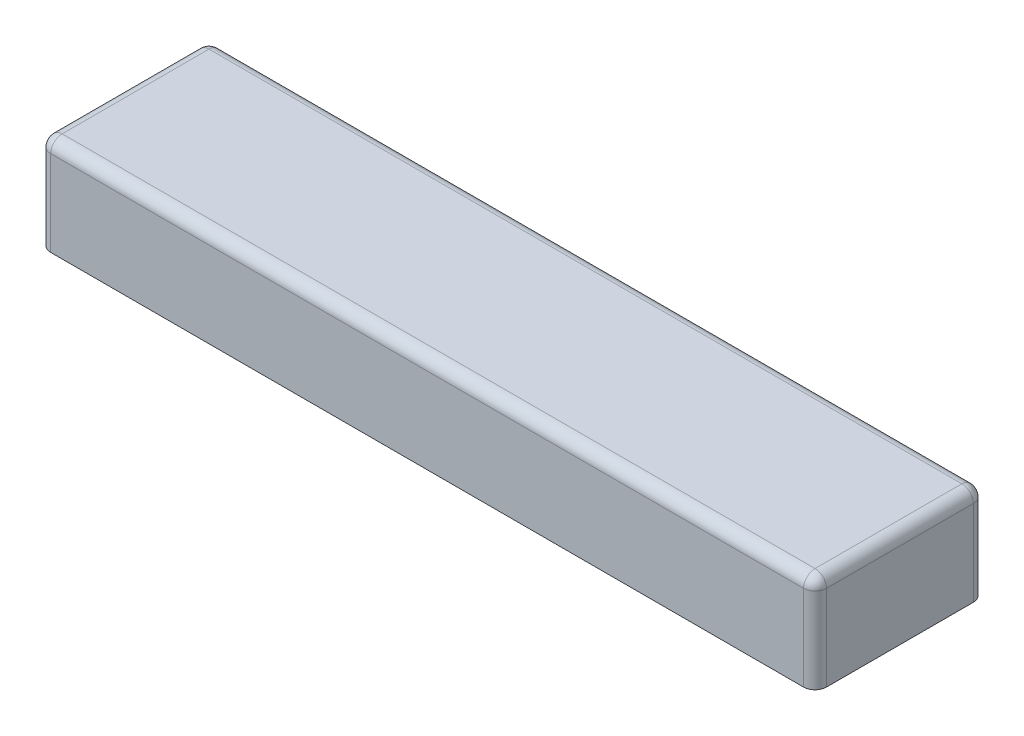
ISO-10303-21;
HEADER;
FILE_DESCRIPTION(('STEP AP214'),'2;1');
FILE_NAME('part.step','',(''),(''),'','','');
FILE_SCHEMA(('AUTOMOTIVE_DESIGN { 1 0 10303 214 1 1 1 1 }'));
ENDSEC;
DATA;
#1=APPLICATION_CONTEXT('core data for automotive mechanical design processes');
#2=APPLICATION_PROTOCOL_DEFINITION('international standard','automotive_design',2000,#1);
#3=PRODUCT_CONTEXT('',#1,'mechanical');
#4=PRODUCT('Part','Part','',(#3));
#5=PRODUCT_RELATED_PRODUCT_CATEGORY('part','',(#4));
#6=PRODUCT_DEFINITION_FORMATION('','',#4);
#7=PRODUCT_DEFINITION_CONTEXT('part definition',#1,'design');
#8=PRODUCT_DEFINITION('design','',#6,#7);
#9=PRODUCT_DEFINITION_SHAPE('','',#8);
#10=(LENGTH_UNIT() NAMED_UNIT(*) SI_UNIT(.MILLI.,.METRE.));
#11=(NAMED_UNIT(*) PLANE_ANGLE_UNIT() SI_UNIT($,.RADIAN.));
#12=(NAMED_UNIT(*) SI_UNIT($,.STERADIAN.) SOLID_ANGLE_UNIT());
#13=UNCERTAINTY_MEASURE_WITH_UNIT(LENGTH_MEASURE(1.E-05),#10,'distance_accuracy_value','');
#14=(GEOMETRIC_REPRESENTATION_CONTEXT(3) GLOBAL_UNCERTAINTY_ASSIGNED_CONTEXT((#13)) GLOBAL_UNIT_ASSIGNED_CONTEXT((#10,
#11,#12)) REPRESENTATION_CONTEXT('',''));
#15=CARTESIAN_POINT('',(0.,0.,0.));
#16=DIRECTION('',(0.,0.,1.));
#17=DIRECTION('',(1.,0.,0.));
#18=AXIS2_PLACEMENT_3D('',#15,#16,#17);
#19=CARTESIAN_POINT('',(0.,25.4,0.));
#20=DIRECTION('',(1.,0.,0.));
#21=DIRECTION('',(0.,0.,-1.));
#22=AXIS2_PLACEMENT_3D('',#19,#20,#21);
#23=PLANE('',#22);
#24=DIRECTION('',(0.,0.,1.));
#25=VECTOR('',#24,1.);
#26=CARTESIAN_POINT('',(0.,22.4,0.));
#27=LINE('',#26,#25);
#28=CARTESIAN_POINT('',(0.,22.4,-3.));
#29=VERTEX_POINT('',#28);
#30=CARTESIAN_POINT('',(0.,22.4,-41.45));
#31=VERTEX_POINT('',#30);
#32=EDGE_CURVE('E51',#29,#31,#27,.F.);
#33=ORIENTED_EDGE('',*,*,#32,.T.);
#34=DIRECTION('',(0.,-1.,0.));
#35=VECTOR('',#34,1.);
#36=CARTESIAN_POINT('',(0.,25.4,-41.45));
#37=LINE('',#36,#35);
#38=CARTESIAN_POINT('',(0.,0.,-41.45));
#39=VERTEX_POINT('',#38);
#40=EDGE_CURVE('E170',#31,#39,#37,.T.);
#41=ORIENTED_EDGE('',*,*,#40,.T.);
#42=DIRECTION('',(0.,0.,1.));
#43=VECTOR('',#42,1.);
#44=CARTESIAN_POINT('',(0.,0.,0.));
#45=LINE('',#44,#43);
#46=CARTESIAN_POINT('',(0.,0.,-3.));
#47=VERTEX_POINT('',#46);
#48=EDGE_CURVE('E199',#39,#47,#45,.T.);
#49=ORIENTED_EDGE('',*,*,#48,.T.);
#50=DIRECTION('',(0.,-1.,0.));
#51=VECTOR('',#50,1.);
#52=CARTESIAN_POINT('',(0.,25.4,-3.));
#53=LINE('',#52,#51);
#54=EDGE_CURVE('E56',#47,#29,#53,.F.);
#55=ORIENTED_EDGE('',*,*,#54,.T.);
#56=EDGE_LOOP('',(#33,#41,#49,#55));
#57=FACE_BOUND('',#56,.T.);
#58=ADVANCED_FACE('F34',(#57),#23,.F.);
#59=CARTESIAN_POINT('',(0.,25.4,0.));
#60=DIRECTION('',(0.,0.,-1.));
#61=DIRECTION('',(-1.,0.,0.));
#62=AXIS2_PLACEMENT_3D('',#59,#60,#61);
#63=PLANE('',#62);
#64=DIRECTION('',(1.,0.,0.));
#65=VECTOR('',#64,1.);
#66=CARTESIAN_POINT('',(0.,0.,0.));
#67=LINE('',#66,#65);
#68=CARTESIAN_POINT('',(3.,0.,0.));
#69=VERTEX_POINT('',#68);
#70=CARTESIAN_POINT('',(200.2,0.,0.));
#71=VERTEX_POINT('',#70);
#72=EDGE_CURVE('E201',#69,#71,#67,.T.);
#73=ORIENTED_EDGE('',*,*,#72,.T.);
#74=DIRECTION('',(0.,-1.,0.));
#75=VECTOR('',#74,1.);
#76=CARTESIAN_POINT('',(200.2,25.4,0.));
#77=LINE('',#76,#75);
#78=CARTESIAN_POINT('',(200.2,22.4,0.));
#79=VERTEX_POINT('',#78);
#80=EDGE_CURVE('E166',#71,#79,#77,.F.);
#81=ORIENTED_EDGE('',*,*,#80,.T.);
#82=DIRECTION('',(1.,0.,0.));
#83=VECTOR('',#82,1.);
#84=CARTESIAN_POINT('',(0.,22.4,0.));
#85=LINE('',#84,#83);
#86=CARTESIAN_POINT('',(3.,22.4,0.));
#87=VERTEX_POINT('',#86);
#88=EDGE_CURVE('E164',#79,#87,#85,.F.);
#89=ORIENTED_EDGE('',*,*,#88,.T.);
#90=DIRECTION('',(0.,-1.,0.));
#91=VECTOR('',#90,1.);
#92=CARTESIAN_POINT('',(3.,25.4,0.));
#93=LINE('',#92,#91);
#94=EDGE_CURVE('E162',#87,#69,#93,.T.);
#95=ORIENTED_EDGE('',*,*,#94,.T.);
#96=EDGE_LOOP('',(#73,#81,#89,#95));
#97=FACE_BOUND('',#96,.T.);
#98=ADVANCED_FACE('F253',(#97),#63,.F.);
#99=CARTESIAN_POINT('',(203.2,25.4,0.));
#100=DIRECTION('',(-1.,0.,0.));
#101=DIRECTION('',(0.,0.,1.));
#102=AXIS2_PLACEMENT_3D('',#99,#100,#101);
#103=PLANE('',#102);
#104=DIRECTION('',(0.,0.,-1.));
#105=VECTOR('',#104,1.);
#106=CARTESIAN_POINT('',(203.2,0.,0.));
#107=LINE('',#106,#105);
#108=CARTESIAN_POINT('',(203.2,0.,-3.));
#109=VERTEX_POINT('',#108);
#110=CARTESIAN_POINT('',(203.2,0.,-41.45));
#111=VERTEX_POINT('',#110);
#112=EDGE_CURVE('E205',#109,#111,#107,.T.);
#113=ORIENTED_EDGE('',*,*,#112,.T.);
#114=DIRECTION('',(0.,-1.,0.));
#115=VECTOR('',#114,1.);
#116=CARTESIAN_POINT('',(203.2,25.4,-41.45));
#117=LINE('',#116,#115);
#118=CARTESIAN_POINT('',(203.2,22.4,-41.45));
#119=VERTEX_POINT('',#118);
#120=EDGE_CURVE('E160',#111,#119,#117,.F.);
#121=ORIENTED_EDGE('',*,*,#120,.T.);
#122=DIRECTION('',(0.,0.,-1.));
#123=VECTOR('',#122,1.);
#124=CARTESIAN_POINT('',(203.2,22.4,0.));
#125=LINE('',#124,#123);
#126=CARTESIAN_POINT('',(203.2,22.4,-3.));
#127=VERTEX_POINT('',#126);
#128=EDGE_CURVE('E158',#119,#127,#125,.F.);
#129=ORIENTED_EDGE('',*,*,#128,.T.);
#130=DIRECTION('',(0.,-1.,0.));
#131=VECTOR('',#130,1.);
#132=CARTESIAN_POINT('',(203.2,25.4,-3.));
#133=LINE('',#132,#131);
#134=EDGE_CURVE('E156',#127,#109,#133,.T.);
#135=ORIENTED_EDGE('',*,*,#134,.T.);
#136=EDGE_LOOP('',(#113,#121,#129,#135));
#137=FACE_BOUND('',#136,.T.);
#138=ADVANCED_FACE('F258',(#137),#103,.F.);
#139=CARTESIAN_POINT('',(0.,25.4,-44.45));
#140=DIRECTION('',(0.,0.,1.));
#141=DIRECTION('',(1.,0.,0.));
#142=AXIS2_PLACEMENT_3D('',#139,#140,#141);
#143=PLANE('',#142);
#144=DIRECTION('',(-1.,0.,0.));
#145=VECTOR('',#144,1.);
#146=CARTESIAN_POINT('',(0.,0.,-44.45));
#147=LINE('',#146,#145);
#148=CARTESIAN_POINT('',(200.2,0.,-44.45));
#149=VERTEX_POINT('',#148);
#150=CARTESIAN_POINT('',(3.,0.,-44.45));
#151=VERTEX_POINT('',#150);
#152=EDGE_CURVE('E141',#149,#151,#147,.T.);
#153=ORIENTED_EDGE('',*,*,#152,.T.);
#154=DIRECTION('',(0.,-1.,0.));
#155=VECTOR('',#154,1.);
#156=CARTESIAN_POINT('',(3.,25.4,-44.45));
#157=LINE('',#156,#155);
#158=CARTESIAN_POINT('',(3.,22.4,-44.45));
#159=VERTEX_POINT('',#158);
#160=EDGE_CURVE('E154',#151,#159,#157,.F.);
#161=ORIENTED_EDGE('',*,*,#160,.T.);
#162=DIRECTION('',(-1.,0.,0.));
#163=VECTOR('',#162,1.);
#164=CARTESIAN_POINT('',(0.,22.4,-44.45));
#165=LINE('',#164,#163);
#166=CARTESIAN_POINT('',(200.2,22.4,-44.45));
#167=VERTEX_POINT('',#166);
#168=EDGE_CURVE('E119',#159,#167,#165,.F.);
#169=ORIENTED_EDGE('',*,*,#168,.T.);
#170=DIRECTION('',(0.,-1.,0.));
#171=VECTOR('',#170,1.);
#172=CARTESIAN_POINT('',(200.2,25.4,-44.45));
#173=LINE('',#172,#171);
#174=EDGE_CURVE('E147',#167,#149,#173,.T.);
#175=ORIENTED_EDGE('',*,*,#174,.T.);
#176=EDGE_LOOP('',(#153,#161,#169,#175));
#177=FACE_BOUND('',#176,.T.);
#178=ADVANCED_FACE('F230',(#177),#143,.F.);
#179=CARTESIAN_POINT('',(0.,25.4,0.));
#180=DIRECTION('',(0.,-1.,0.));
#181=DIRECTION('',(0.,0.,-1.));
#182=AXIS2_PLACEMENT_3D('',#179,#180,#181);
#183=PLANE('',#182);
#184=DIRECTION('',(0.,0.,-1.));
#185=VECTOR('',#184,1.);
#186=CARTESIAN_POINT('',(200.2,25.4,0.));
#187=LINE('',#186,#185);
#188=CARTESIAN_POINT('',(200.2,25.4,-3.));
#189=VERTEX_POINT('',#188);
#190=CARTESIAN_POINT('',(200.2,25.4,-41.45));
#191=VERTEX_POINT('',#190);
#192=EDGE_CURVE('E145',#189,#191,#187,.T.);
#193=ORIENTED_EDGE('',*,*,#192,.T.);
#194=DIRECTION('',(-1.,0.,0.));
#195=VECTOR('',#194,1.);
#196=CARTESIAN_POINT('',(0.,25.4,-41.45));
#197=LINE('',#196,#195);
#198=CARTESIAN_POINT('',(3.,25.4,-41.45));
#199=VERTEX_POINT('',#198);
#200=EDGE_CURVE('E117',#191,#199,#197,.T.);
#201=ORIENTED_EDGE('',*,*,#200,.T.);
#202=DIRECTION('',(0.,0.,1.));
#203=VECTOR('',#202,1.);
#204=CARTESIAN_POINT('',(3.,25.4,0.));
#205=LINE('',#204,#203);
#206=CARTESIAN_POINT('',(3.,25.4,-3.));
#207=VERTEX_POINT('',#206);
#208=EDGE_CURVE('E134',#199,#207,#205,.T.);
#209=ORIENTED_EDGE('',*,*,#208,.T.);
#210=DIRECTION('',(1.,0.,0.));
#211=VECTOR('',#210,1.);
#212=CARTESIAN_POINT('',(0.,25.4,-3.));
#213=LINE('',#212,#211);
#214=EDGE_CURVE('E140',#207,#189,#213,.T.);
#215=ORIENTED_EDGE('',*,*,#214,.T.);
#216=EDGE_LOOP('',(#193,#201,#209,#215));
#217=FACE_BOUND('',#216,.T.);
#218=ADVANCED_FACE('F143',(#217),#183,.F.);
#219=CARTESIAN_POINT('',(0.,0.,0.));
#220=DIRECTION('',(0.,-1.,0.));
#221=DIRECTION('',(0.,0.,-1.));
#222=AXIS2_PLACEMENT_3D('',#219,#220,#221);
#223=PLANE('',#222);
#224=ORIENTED_EDGE('',*,*,#48,.F.);
#225=CARTESIAN_POINT('',(3.,0.,-41.45));
#226=DIRECTION('',(0.,-1.,0.));
#227=DIRECTION('',(0.,0.,-1.));
#228=AXIS2_PLACEMENT_3D('',#225,#226,#227);
#229=CIRCLE('',#228,3.);
#230=EDGE_CURVE('E11',#39,#151,#229,.T.);
#231=ORIENTED_EDGE('',*,*,#230,.T.);
#232=ORIENTED_EDGE('',*,*,#152,.F.);
#233=CARTESIAN_POINT('',(200.2,0.,-41.45));
#234=DIRECTION('',(0.,-1.,0.));
#235=DIRECTION('',(0.,0.,-1.));
#236=AXIS2_PLACEMENT_3D('',#233,#234,#235);
#237=CIRCLE('',#236,3.);
#238=EDGE_CURVE('E43',#149,#111,#237,.T.);
#239=ORIENTED_EDGE('',*,*,#238,.T.);
#240=ORIENTED_EDGE('',*,*,#112,.F.);
#241=CARTESIAN_POINT('',(200.2,0.,-3.));
#242=DIRECTION('',(0.,-1.,0.));
#243=DIRECTION('',(0.,0.,-1.));
#244=AXIS2_PLACEMENT_3D('',#241,#242,#243);
#245=CIRCLE('',#244,3.);
#246=EDGE_CURVE('E174',#109,#71,#245,.T.);
#247=ORIENTED_EDGE('',*,*,#246,.T.);
#248=ORIENTED_EDGE('',*,*,#72,.F.);
#249=CARTESIAN_POINT('',(3.,0.,-3.));
#250=DIRECTION('',(0.,-1.,0.));
#251=DIRECTION('',(0.,0.,-1.));
#252=AXIS2_PLACEMENT_3D('',#249,#250,#251);
#253=CIRCLE('',#252,3.);
#254=EDGE_CURVE('E172',#69,#47,#253,.T.);
#255=ORIENTED_EDGE('',*,*,#254,.T.);
#256=EDGE_LOOP('',(#224,#231,#232,#239,#240,#247,#248,#255));
#257=FACE_BOUND('',#256,.T.);
#258=ADVANCED_FACE('F236',(#257),#223,.T.);
#259=CARTESIAN_POINT('',(200.2,25.4,-3.));
#260=DIRECTION('',(0.,-1.,0.));
#261=DIRECTION('',(0.,0.,-1.));
#262=AXIS2_PLACEMENT_3D('',#259,#260,#261);
#263=CYLINDRICAL_SURFACE('',#262,3.);
#264=ORIENTED_EDGE('',*,*,#246,.F.);
#265=ORIENTED_EDGE('',*,*,#134,.F.);
#266=CARTESIAN_POINT('',(200.2,22.4,-3.));
#267=DIRECTION('',(0.,1.,0.));
#268=DIRECTION('',(0.,0.,1.));
#269=AXIS2_PLACEMENT_3D('',#266,#267,#268);
#270=CIRCLE('',#269,3.);
#271=EDGE_CURVE('E38',#79,#127,#270,.T.);
#272=ORIENTED_EDGE('',*,*,#271,.F.);
#273=ORIENTED_EDGE('',*,*,#80,.F.);
#274=EDGE_LOOP('',(#264,#265,#272,#273));
#275=FACE_BOUND('',#274,.T.);
#276=ADVANCED_FACE('F36',(#275),#263,.T.);
#277=CARTESIAN_POINT('',(0.,22.4,-3.));
#278=DIRECTION('',(1.,0.,0.));
#279=DIRECTION('',(0.,0.,-1.));
#280=AXIS2_PLACEMENT_3D('',#277,#278,#279);
#281=CYLINDRICAL_SURFACE('',#280,3.);
#282=CARTESIAN_POINT('',(3.,22.4,-3.));
#283=DIRECTION('',(-1.,0.,0.));
#284=DIRECTION('',(0.,0.,1.));
#285=AXIS2_PLACEMENT_3D('',#282,#283,#284);
#286=CIRCLE('',#285,3.);
#287=EDGE_CURVE('E191',#87,#207,#286,.T.);
#288=ORIENTED_EDGE('',*,*,#287,.F.);
#289=ORIENTED_EDGE('',*,*,#88,.F.);
#290=CARTESIAN_POINT('',(200.2,22.4,-3.));
#291=DIRECTION('',(1.,0.,0.));
#292=DIRECTION('',(0.,0.,-1.));
#293=AXIS2_PLACEMENT_3D('',#290,#291,#292);
#294=CIRCLE('',#293,3.);
#295=EDGE_CURVE('E193',#189,#79,#294,.T.);
#296=ORIENTED_EDGE('',*,*,#295,.F.);
#297=ORIENTED_EDGE('',*,*,#214,.F.);
#298=EDGE_LOOP('',(#288,#289,#296,#297));
#299=FACE_BOUND('',#298,.T.);
#300=ADVANCED_FACE('F214',(#299),#281,.T.);
#301=CARTESIAN_POINT('',(3.,25.4,-3.));
#302=DIRECTION('',(0.,-1.,0.));
#303=DIRECTION('',(0.,0.,-1.));
#304=AXIS2_PLACEMENT_3D('',#301,#302,#303);
#305=CYLINDRICAL_SURFACE('',#304,3.);
#306=ORIENTED_EDGE('',*,*,#254,.F.);
#307=ORIENTED_EDGE('',*,*,#94,.F.);
#308=CARTESIAN_POINT('',(3.,22.4,-3.));
#309=DIRECTION('',(0.,1.,0.));
#310=DIRECTION('',(0.,0.,1.));
#311=AXIS2_PLACEMENT_3D('',#308,#309,#310);
#312=CIRCLE('',#311,3.);
#313=EDGE_CURVE('E188',#29,#87,#312,.T.);
#314=ORIENTED_EDGE('',*,*,#313,.F.);
#315=ORIENTED_EDGE('',*,*,#54,.F.);
#316=EDGE_LOOP('',(#306,#307,#314,#315));
#317=FACE_BOUND('',#316,.T.);
#318=ADVANCED_FACE('F241',(#317),#305,.T.);
#319=CARTESIAN_POINT('',(200.2,22.4,-3.));
#320=DIRECTION('',(0.,0.,1.));
#321=DIRECTION('',(1.,0.,0.));
#322=AXIS2_PLACEMENT_3D('',#319,#320,#321);
#323=SPHERICAL_SURFACE('',#322,3.);
#324=ORIENTED_EDGE('',*,*,#295,.T.);
#325=ORIENTED_EDGE('',*,*,#271,.T.);
#326=CARTESIAN_POINT('',(200.2,22.4,-3.));
#327=DIRECTION('',(0.,0.,1.));
#328=DIRECTION('',(1.,0.,0.));
#329=AXIS2_PLACEMENT_3D('',#326,#327,#328);
#330=CIRCLE('',#329,3.);
#331=EDGE_CURVE('E185',#189,#127,#330,.F.);
#332=ORIENTED_EDGE('',*,*,#331,.F.);
#333=EDGE_LOOP('',(#324,#325,#332));
#334=FACE_BOUND('',#333,.T.);
#335=ADVANCED_FACE('F215',(#334),#323,.T.);
#336=CARTESIAN_POINT('',(3.,22.4,-3.));
#337=DIRECTION('',(0.,0.,1.));
#338=DIRECTION('',(1.,0.,0.));
#339=AXIS2_PLACEMENT_3D('',#336,#337,#338);
#340=SPHERICAL_SURFACE('',#339,3.);
#341=ORIENTED_EDGE('',*,*,#313,.T.);
#342=ORIENTED_EDGE('',*,*,#287,.T.);
#343=CARTESIAN_POINT('',(3.,22.4,-3.));
#344=DIRECTION('',(0.,0.,1.));
#345=DIRECTION('',(1.,0.,0.));
#346=AXIS2_PLACEMENT_3D('',#343,#344,#345);
#347=CIRCLE('',#346,3.);
#348=EDGE_CURVE('E137',#29,#207,#347,.F.);
#349=ORIENTED_EDGE('',*,*,#348,.F.);
#350=EDGE_LOOP('',(#341,#342,#349));
#351=FACE_BOUND('',#350,.T.);
#352=ADVANCED_FACE('F243',(#351),#340,.T.);
#353=CARTESIAN_POINT('',(200.2,25.4,-41.45));
#354=DIRECTION('',(0.,-1.,0.));
#355=DIRECTION('',(0.,0.,-1.));
#356=AXIS2_PLACEMENT_3D('',#353,#354,#355);
#357=CYLINDRICAL_SURFACE('',#356,3.);
#358=ORIENTED_EDGE('',*,*,#238,.F.);
#359=ORIENTED_EDGE('',*,*,#174,.F.);
#360=CARTESIAN_POINT('',(200.2,22.4,-41.45));
#361=DIRECTION('',(0.,1.,0.));
#362=DIRECTION('',(0.,0.,1.));
#363=AXIS2_PLACEMENT_3D('',#360,#361,#362);
#364=CIRCLE('',#363,3.);
#365=EDGE_CURVE('E181',#119,#167,#364,.T.);
#366=ORIENTED_EDGE('',*,*,#365,.F.);
#367=ORIENTED_EDGE('',*,*,#120,.F.);
#368=EDGE_LOOP('',(#358,#359,#366,#367));
#369=FACE_BOUND('',#368,.T.);
#370=ADVANCED_FACE('F227',(#369),#357,.T.);
#371=CARTESIAN_POINT('',(200.2,22.4,0.));
#372=DIRECTION('',(0.,0.,-1.));
#373=DIRECTION('',(-1.,0.,0.));
#374=AXIS2_PLACEMENT_3D('',#371,#372,#373);
#375=CYLINDRICAL_SURFACE('',#374,3.);
#376=ORIENTED_EDGE('',*,*,#331,.T.);
#377=ORIENTED_EDGE('',*,*,#128,.F.);
#378=CARTESIAN_POINT('',(200.2,22.4,-41.45));
#379=DIRECTION('',(0.,0.,-1.));
#380=DIRECTION('',(-1.,0.,0.));
#381=AXIS2_PLACEMENT_3D('',#378,#379,#380);
#382=CIRCLE('',#381,3.);
#383=EDGE_CURVE('E131',#191,#119,#382,.T.);
#384=ORIENTED_EDGE('',*,*,#383,.F.);
#385=ORIENTED_EDGE('',*,*,#192,.F.);
#386=EDGE_LOOP('',(#376,#377,#384,#385));
#387=FACE_BOUND('',#386,.T.);
#388=ADVANCED_FACE('F218',(#387),#375,.T.);
#389=CARTESIAN_POINT('',(3.,22.4,0.));
#390=DIRECTION('',(0.,0.,1.));
#391=DIRECTION('',(1.,0.,0.));
#392=AXIS2_PLACEMENT_3D('',#389,#390,#391);
#393=CYLINDRICAL_SURFACE('',#392,3.);
#394=ORIENTED_EDGE('',*,*,#348,.T.);
#395=ORIENTED_EDGE('',*,*,#208,.F.);
#396=CARTESIAN_POINT('',(3.,22.4,-41.45));
#397=DIRECTION('',(0.,0.,-1.));
#398=DIRECTION('',(-1.,0.,0.));
#399=AXIS2_PLACEMENT_3D('',#396,#397,#398);
#400=CIRCLE('',#399,3.);
#401=EDGE_CURVE('E125',#31,#199,#400,.T.);
#402=ORIENTED_EDGE('',*,*,#401,.F.);
#403=ORIENTED_EDGE('',*,*,#32,.F.);
#404=EDGE_LOOP('',(#394,#395,#402,#403));
#405=FACE_BOUND('',#404,.T.);
#406=ADVANCED_FACE('F135',(#405),#393,.T.);
#407=CARTESIAN_POINT('',(3.,25.4,-41.45));
#408=DIRECTION('',(0.,-1.,0.));
#409=DIRECTION('',(0.,0.,-1.));
#410=AXIS2_PLACEMENT_3D('',#407,#408,#409);
#411=CYLINDRICAL_SURFACE('',#410,3.);
#412=ORIENTED_EDGE('',*,*,#230,.F.);
#413=ORIENTED_EDGE('',*,*,#40,.F.);
#414=CARTESIAN_POINT('',(3.,22.4,-41.45));
#415=DIRECTION('',(0.,1.,0.));
#416=DIRECTION('',(0.,0.,1.));
#417=AXIS2_PLACEMENT_3D('',#414,#415,#416);
#418=CIRCLE('',#417,3.);
#419=EDGE_CURVE('E129',#159,#31,#418,.T.);
#420=ORIENTED_EDGE('',*,*,#419,.F.);
#421=ORIENTED_EDGE('',*,*,#160,.F.);
#422=EDGE_LOOP('',(#412,#413,#420,#421));
#423=FACE_BOUND('',#422,.T.);
#424=ADVANCED_FACE('F234',(#423),#411,.T.);
#425=CARTESIAN_POINT('',(200.2,22.4,-41.45));
#426=DIRECTION('',(0.,0.,1.));
#427=DIRECTION('',(1.,0.,0.));
#428=AXIS2_PLACEMENT_3D('',#425,#426,#427);
#429=SPHERICAL_SURFACE('',#428,3.);
#430=ORIENTED_EDGE('',*,*,#383,.T.);
#431=ORIENTED_EDGE('',*,*,#365,.T.);
#432=CARTESIAN_POINT('',(200.2,22.4,-41.45));
#433=DIRECTION('',(1.,0.,0.));
#434=DIRECTION('',(0.,0.,-1.));
#435=AXIS2_PLACEMENT_3D('',#432,#433,#434);
#436=CIRCLE('',#435,3.);
#437=EDGE_CURVE('E122',#191,#167,#436,.F.);
#438=ORIENTED_EDGE('',*,*,#437,.F.);
#439=EDGE_LOOP('',(#430,#431,#438));
#440=FACE_BOUND('',#439,.T.);
#441=ADVANCED_FACE('F222',(#440),#429,.T.);
#442=CARTESIAN_POINT('',(3.,22.4,-41.45));
#443=DIRECTION('',(0.,0.,1.));
#444=DIRECTION('',(1.,0.,0.));
#445=AXIS2_PLACEMENT_3D('',#442,#443,#444);
#446=SPHERICAL_SURFACE('',#445,3.);
#447=ORIENTED_EDGE('',*,*,#419,.T.);
#448=ORIENTED_EDGE('',*,*,#401,.T.);
#449=CARTESIAN_POINT('',(3.,22.4,-41.45));
#450=DIRECTION('',(-1.,0.,0.));
#451=DIRECTION('',(0.,0.,1.));
#452=AXIS2_PLACEMENT_3D('',#449,#450,#451);
#453=CIRCLE('',#452,3.);
#454=EDGE_CURVE('E113',#159,#199,#453,.F.);
#455=ORIENTED_EDGE('',*,*,#454,.F.);
#456=EDGE_LOOP('',(#447,#448,#455));
#457=FACE_BOUND('',#456,.T.);
#458=ADVANCED_FACE('F127',(#457),#446,.T.);
#459=CARTESIAN_POINT('',(0.,22.4,-41.45));
#460=DIRECTION('',(-1.,0.,0.));
#461=DIRECTION('',(0.,0.,1.));
#462=AXIS2_PLACEMENT_3D('',#459,#460,#461);
#463=CYLINDRICAL_SURFACE('',#462,3.);
#464=ORIENTED_EDGE('',*,*,#437,.T.);
#465=ORIENTED_EDGE('',*,*,#168,.F.);
#466=ORIENTED_EDGE('',*,*,#454,.T.);
#467=ORIENTED_EDGE('',*,*,#200,.F.);
#468=EDGE_LOOP('',(#464,#465,#466,#467));
#469=FACE_BOUND('',#468,.T.);
#470=ADVANCED_FACE('F115',(#469),#463,.T.);
#471=CLOSED_SHELL('',(#58,#98,#138,#178,#218,#258,#276,#300,#318,#335,#352,#370,#388,#406,#424,
#441,#458,#470));
#472=MANIFOLD_SOLID_BREP('B2',#471);
#473=ADVANCED_BREP_SHAPE_REPRESENTATION('',(#18,#472),#14);
#474=SHAPE_DEFINITION_REPRESENTATION(#9,#473);
ENDSEC;
END-ISO-10303-21;
